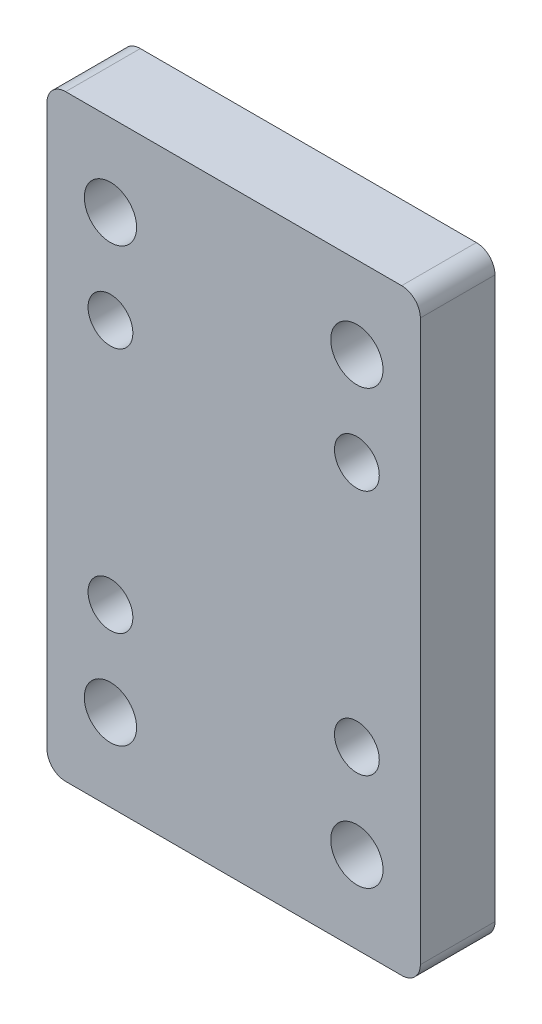
ISO-10303-21;
HEADER;
FILE_DESCRIPTION(('STEP AP214'),'2;1');
FILE_NAME('part.step','',(''),(''),'','','');
FILE_SCHEMA(('AUTOMOTIVE_DESIGN { 1 0 10303 214 1 1 1 1 }'));
ENDSEC;
DATA;
#1=APPLICATION_CONTEXT('core data for automotive mechanical design processes');
#2=APPLICATION_PROTOCOL_DEFINITION('international standard','automotive_design',2000,#1);
#3=PRODUCT_CONTEXT('',#1,'mechanical');
#4=PRODUCT('Part','Part','',(#3));
#5=PRODUCT_RELATED_PRODUCT_CATEGORY('part','',(#4));
#6=PRODUCT_DEFINITION_FORMATION('','',#4);
#7=PRODUCT_DEFINITION_CONTEXT('part definition',#1,'design');
#8=PRODUCT_DEFINITION('design','',#6,#7);
#9=PRODUCT_DEFINITION_SHAPE('','',#8);
#10=(LENGTH_UNIT() NAMED_UNIT(*) SI_UNIT(.MILLI.,.METRE.));
#11=(NAMED_UNIT(*) PLANE_ANGLE_UNIT() SI_UNIT($,.RADIAN.));
#12=(NAMED_UNIT(*) SI_UNIT($,.STERADIAN.) SOLID_ANGLE_UNIT());
#13=UNCERTAINTY_MEASURE_WITH_UNIT(LENGTH_MEASURE(1.E-05),#10,'distance_accuracy_value','');
#14=(GEOMETRIC_REPRESENTATION_CONTEXT(3) GLOBAL_UNCERTAINTY_ASSIGNED_CONTEXT((#13)) GLOBAL_UNIT_ASSIGNED_CONTEXT((#10,
#11,#12)) REPRESENTATION_CONTEXT('',''));
#15=CARTESIAN_POINT('',(0.,0.,0.));
#16=DIRECTION('',(0.,0.,1.));
#17=DIRECTION('',(1.,0.,0.));
#18=AXIS2_PLACEMENT_3D('',#15,#16,#17);
#19=CARTESIAN_POINT('',(-25.,40.,10.));
#20=DIRECTION('',(0.,0.,-1.));
#21=DIRECTION('',(-1.,0.,0.));
#22=AXIS2_PLACEMENT_3D('',#19,#20,#21);
#23=PLANE('',#22);
#24=CARTESIAN_POINT('',(-16.5,-29.,10.));
#25=DIRECTION('',(0.,0.,1.));
#26=DIRECTION('',(-1.,0.,0.));
#27=AXIS2_PLACEMENT_3D('',#24,#25,#26);
#28=CIRCLE('',#27,3.5);
#29=CARTESIAN_POINT('',(-20.,-29.,10.));
#30=VERTEX_POINT('',#29);
#31=EDGE_CURVE('E209',#30,#30,#28,.T.);
#32=ORIENTED_EDGE('',*,*,#31,.F.);
#33=EDGE_LOOP('',(#32));
#34=FACE_BOUND('',#33,.T.);
#35=CARTESIAN_POINT('',(16.5,-16.5,10.));
#36=DIRECTION('',(0.,0.,-1.));
#37=DIRECTION('',(1.,0.,0.));
#38=AXIS2_PLACEMENT_3D('',#35,#36,#37);
#39=CIRCLE('',#38,3.);
#40=CARTESIAN_POINT('',(19.5,-16.5,10.));
#41=VERTEX_POINT('',#40);
#42=EDGE_CURVE('E203',#41,#41,#39,.T.);
#43=ORIENTED_EDGE('',*,*,#42,.T.);
#44=EDGE_LOOP('',(#43));
#45=FACE_BOUND('',#44,.T.);
#46=CARTESIAN_POINT('',(16.5,-29.,10.));
#47=DIRECTION('',(0.,0.,-1.));
#48=DIRECTION('',(1.,0.,0.));
#49=AXIS2_PLACEMENT_3D('',#46,#47,#48);
#50=CIRCLE('',#49,3.5);
#51=CARTESIAN_POINT('',(20.,-29.,10.));
#52=VERTEX_POINT('',#51);
#53=EDGE_CURVE('E197',#52,#52,#50,.T.);
#54=ORIENTED_EDGE('',*,*,#53,.T.);
#55=EDGE_LOOP('',(#54));
#56=FACE_BOUND('',#55,.T.);
#57=CARTESIAN_POINT('',(16.5,29.,10.));
#58=DIRECTION('',(0.,0.,1.));
#59=DIRECTION('',(1.,0.,0.));
#60=AXIS2_PLACEMENT_3D('',#57,#58,#59);
#61=CIRCLE('',#60,3.5);
#62=CARTESIAN_POINT('',(20.,29.,10.));
#63=VERTEX_POINT('',#62);
#64=EDGE_CURVE('E185',#63,#63,#61,.T.);
#65=ORIENTED_EDGE('',*,*,#64,.F.);
#66=EDGE_LOOP('',(#65));
#67=FACE_BOUND('',#66,.T.);
#68=CARTESIAN_POINT('',(-16.5,16.5,10.));
#69=DIRECTION('',(0.,0.,-1.));
#70=DIRECTION('',(-1.,0.,0.));
#71=AXIS2_PLACEMENT_3D('',#68,#69,#70);
#72=CIRCLE('',#71,3.);
#73=CARTESIAN_POINT('',(-19.5,16.5,10.));
#74=VERTEX_POINT('',#73);
#75=EDGE_CURVE('E180',#74,#74,#72,.T.);
#76=ORIENTED_EDGE('',*,*,#75,.T.);
#77=EDGE_LOOP('',(#76));
#78=FACE_BOUND('',#77,.T.);
#79=CARTESIAN_POINT('',(-16.5,29.,10.));
#80=DIRECTION('',(0.,0.,-1.));
#81=DIRECTION('',(-1.,0.,0.));
#82=AXIS2_PLACEMENT_3D('',#79,#80,#81);
#83=CIRCLE('',#82,3.5);
#84=CARTESIAN_POINT('',(-20.,29.,10.));
#85=VERTEX_POINT('',#84);
#86=EDGE_CURVE('E175',#85,#85,#83,.T.);
#87=ORIENTED_EDGE('',*,*,#86,.T.);
#88=EDGE_LOOP('',(#87));
#89=FACE_BOUND('',#88,.T.);
#90=DIRECTION('',(1.,0.,0.));
#91=VECTOR('',#90,1.);
#92=CARTESIAN_POINT('',(-25.,-40.,10.));
#93=LINE('',#92,#91);
#94=CARTESIAN_POINT('',(-22.5,-40.,10.));
#95=VERTEX_POINT('',#94);
#96=CARTESIAN_POINT('',(22.5,-40.,10.));
#97=VERTEX_POINT('',#96);
#98=EDGE_CURVE('E166',#95,#97,#93,.T.);
#99=ORIENTED_EDGE('',*,*,#98,.T.);
#100=CARTESIAN_POINT('',(22.5,-37.5,10.));
#101=DIRECTION('',(0.,0.,-1.));
#102=DIRECTION('',(-1.,0.,0.));
#103=AXIS2_PLACEMENT_3D('',#100,#101,#102);
#104=CIRCLE('',#103,2.5);
#105=CARTESIAN_POINT('',(25.,-37.5,10.));
#106=VERTEX_POINT('',#105);
#107=EDGE_CURVE('E144',#97,#106,#104,.F.);
#108=ORIENTED_EDGE('',*,*,#107,.T.);
#109=DIRECTION('',(0.,1.,0.));
#110=VECTOR('',#109,1.);
#111=CARTESIAN_POINT('',(25.,-40.,10.));
#112=LINE('',#111,#110);
#113=CARTESIAN_POINT('',(25.,37.5,10.));
#114=VERTEX_POINT('',#113);
#115=EDGE_CURVE('E114',#106,#114,#112,.T.);
#116=ORIENTED_EDGE('',*,*,#115,.T.);
#117=CARTESIAN_POINT('',(22.5,37.5,10.));
#118=DIRECTION('',(0.,0.,-1.));
#119=DIRECTION('',(-1.,0.,0.));
#120=AXIS2_PLACEMENT_3D('',#117,#118,#119);
#121=CIRCLE('',#120,2.5);
#122=CARTESIAN_POINT('',(22.5,40.,10.));
#123=VERTEX_POINT('',#122);
#124=EDGE_CURVE('E50',#114,#123,#121,.F.);
#125=ORIENTED_EDGE('',*,*,#124,.T.);
#126=DIRECTION('',(-1.,0.,0.));
#127=VECTOR('',#126,1.);
#128=CARTESIAN_POINT('',(-25.,40.,10.));
#129=LINE('',#128,#127);
#130=CARTESIAN_POINT('',(-22.5,40.,10.));
#131=VERTEX_POINT('',#130);
#132=EDGE_CURVE('E130',#123,#131,#129,.T.);
#133=ORIENTED_EDGE('',*,*,#132,.T.);
#134=CARTESIAN_POINT('',(-22.5,37.5,10.));
#135=DIRECTION('',(0.,0.,-1.));
#136=DIRECTION('',(-1.,0.,0.));
#137=AXIS2_PLACEMENT_3D('',#134,#135,#136);
#138=CIRCLE('',#137,2.5);
#139=CARTESIAN_POINT('',(-25.,37.5,10.));
#140=VERTEX_POINT('',#139);
#141=EDGE_CURVE('E140',#131,#140,#138,.F.);
#142=ORIENTED_EDGE('',*,*,#141,.T.);
#143=DIRECTION('',(0.,-1.,0.));
#144=VECTOR('',#143,1.);
#145=CARTESIAN_POINT('',(-25.,-40.,10.));
#146=LINE('',#145,#144);
#147=CARTESIAN_POINT('',(-25.,-37.5,10.));
#148=VERTEX_POINT('',#147);
#149=EDGE_CURVE('E124',#140,#148,#146,.T.);
#150=ORIENTED_EDGE('',*,*,#149,.T.);
#151=CARTESIAN_POINT('',(-22.5,-37.5,10.));
#152=DIRECTION('',(0.,0.,-1.));
#153=DIRECTION('',(-1.,0.,0.));
#154=AXIS2_PLACEMENT_3D('',#151,#152,#153);
#155=CIRCLE('',#154,2.5);
#156=EDGE_CURVE('E142',#148,#95,#155,.F.);
#157=ORIENTED_EDGE('',*,*,#156,.T.);
#158=EDGE_LOOP('',(#99,#108,#116,#125,#133,#142,#150,#157));
#159=FACE_BOUND('',#158,.T.);
#160=CARTESIAN_POINT('',(16.5,16.5,10.));
#161=DIRECTION('',(0.,0.,1.));
#162=DIRECTION('',(1.,0.,0.));
#163=AXIS2_PLACEMENT_3D('',#160,#161,#162);
#164=CIRCLE('',#163,3.);
#165=CARTESIAN_POINT('',(19.5,16.5,10.));
#166=VERTEX_POINT('',#165);
#167=EDGE_CURVE('E191',#166,#166,#164,.T.);
#168=ORIENTED_EDGE('',*,*,#167,.F.);
#169=EDGE_LOOP('',(#168));
#170=FACE_BOUND('',#169,.T.);
#171=CARTESIAN_POINT('',(-16.5,-16.5,10.));
#172=DIRECTION('',(0.,0.,1.));
#173=DIRECTION('',(-1.,0.,0.));
#174=AXIS2_PLACEMENT_3D('',#171,#172,#173);
#175=CIRCLE('',#174,3.);
#176=CARTESIAN_POINT('',(-19.5,-16.5,10.));
#177=VERTEX_POINT('',#176);
#178=EDGE_CURVE('E215',#177,#177,#175,.T.);
#179=ORIENTED_EDGE('',*,*,#178,.F.);
#180=EDGE_LOOP('',(#179));
#181=FACE_BOUND('',#180,.T.);
#182=ADVANCED_FACE('F30',(#34,#45,#56,#67,#78,#89,#159,#170,#181),#23,.F.);
#183=CARTESIAN_POINT('',(-25.,40.,0.));
#184=DIRECTION('',(0.,0.,-1.));
#185=DIRECTION('',(-1.,0.,0.));
#186=AXIS2_PLACEMENT_3D('',#183,#184,#185);
#187=PLANE('',#186);
#188=CARTESIAN_POINT('',(-16.5,-29.,0.));
#189=DIRECTION('',(0.,0.,1.));
#190=DIRECTION('',(-1.,0.,0.));
#191=AXIS2_PLACEMENT_3D('',#188,#189,#190);
#192=CIRCLE('',#191,3.5);
#193=CARTESIAN_POINT('',(-20.,-29.,0.));
#194=VERTEX_POINT('',#193);
#195=EDGE_CURVE('E212',#194,#194,#192,.T.);
#196=ORIENTED_EDGE('',*,*,#195,.T.);
#197=EDGE_LOOP('',(#196));
#198=FACE_BOUND('',#197,.T.);
#199=CARTESIAN_POINT('',(16.5,-16.5,0.));
#200=DIRECTION('',(0.,0.,-1.));
#201=DIRECTION('',(1.,0.,0.));
#202=AXIS2_PLACEMENT_3D('',#199,#200,#201);
#203=CIRCLE('',#202,3.);
#204=CARTESIAN_POINT('',(19.5,-16.5,0.));
#205=VERTEX_POINT('',#204);
#206=EDGE_CURVE('E206',#205,#205,#203,.T.);
#207=ORIENTED_EDGE('',*,*,#206,.F.);
#208=EDGE_LOOP('',(#207));
#209=FACE_BOUND('',#208,.T.);
#210=CARTESIAN_POINT('',(16.5,-29.,0.));
#211=DIRECTION('',(0.,0.,-1.));
#212=DIRECTION('',(1.,0.,0.));
#213=AXIS2_PLACEMENT_3D('',#210,#211,#212);
#214=CIRCLE('',#213,3.5);
#215=CARTESIAN_POINT('',(20.,-29.,0.));
#216=VERTEX_POINT('',#215);
#217=EDGE_CURVE('E200',#216,#216,#214,.T.);
#218=ORIENTED_EDGE('',*,*,#217,.F.);
#219=EDGE_LOOP('',(#218));
#220=FACE_BOUND('',#219,.T.);
#221=CARTESIAN_POINT('',(16.5,29.,0.));
#222=DIRECTION('',(0.,0.,1.));
#223=DIRECTION('',(1.,0.,0.));
#224=AXIS2_PLACEMENT_3D('',#221,#222,#223);
#225=CIRCLE('',#224,3.5);
#226=CARTESIAN_POINT('',(20.,29.,0.));
#227=VERTEX_POINT('',#226);
#228=EDGE_CURVE('E188',#227,#227,#225,.T.);
#229=ORIENTED_EDGE('',*,*,#228,.T.);
#230=EDGE_LOOP('',(#229));
#231=FACE_BOUND('',#230,.T.);
#232=CARTESIAN_POINT('',(-16.5,16.5,0.));
#233=DIRECTION('',(0.,0.,-1.));
#234=DIRECTION('',(-1.,0.,0.));
#235=AXIS2_PLACEMENT_3D('',#232,#233,#234);
#236=CIRCLE('',#235,3.);
#237=CARTESIAN_POINT('',(-19.5,16.5,0.));
#238=VERTEX_POINT('',#237);
#239=EDGE_CURVE('E182',#238,#238,#236,.T.);
#240=ORIENTED_EDGE('',*,*,#239,.F.);
#241=EDGE_LOOP('',(#240));
#242=FACE_BOUND('',#241,.T.);
#243=CARTESIAN_POINT('',(-16.5,29.,0.));
#244=DIRECTION('',(0.,0.,-1.));
#245=DIRECTION('',(-1.,0.,0.));
#246=AXIS2_PLACEMENT_3D('',#243,#244,#245);
#247=CIRCLE('',#246,3.5);
#248=CARTESIAN_POINT('',(-20.,29.,0.));
#249=VERTEX_POINT('',#248);
#250=EDGE_CURVE('E171',#249,#249,#247,.T.);
#251=ORIENTED_EDGE('',*,*,#250,.F.);
#252=EDGE_LOOP('',(#251));
#253=FACE_BOUND('',#252,.T.);
#254=DIRECTION('',(0.,1.,0.));
#255=VECTOR('',#254,1.);
#256=CARTESIAN_POINT('',(25.,-40.,0.));
#257=LINE('',#256,#255);
#258=CARTESIAN_POINT('',(25.,-37.5,0.));
#259=VERTEX_POINT('',#258);
#260=CARTESIAN_POINT('',(25.,37.5,0.));
#261=VERTEX_POINT('',#260);
#262=EDGE_CURVE('E112',#259,#261,#257,.T.);
#263=ORIENTED_EDGE('',*,*,#262,.F.);
#264=CARTESIAN_POINT('',(22.5,-37.5,0.));
#265=DIRECTION('',(0.,0.,-1.));
#266=DIRECTION('',(-1.,0.,0.));
#267=AXIS2_PLACEMENT_3D('',#264,#265,#266);
#268=CIRCLE('',#267,2.5);
#269=CARTESIAN_POINT('',(22.5,-40.,0.));
#270=VERTEX_POINT('',#269);
#271=EDGE_CURVE('E95',#259,#270,#268,.T.);
#272=ORIENTED_EDGE('',*,*,#271,.T.);
#273=DIRECTION('',(1.,0.,0.));
#274=VECTOR('',#273,1.);
#275=CARTESIAN_POINT('',(-25.,-40.,0.));
#276=LINE('',#275,#274);
#277=CARTESIAN_POINT('',(-22.5,-40.,0.));
#278=VERTEX_POINT('',#277);
#279=EDGE_CURVE('E122',#278,#270,#276,.T.);
#280=ORIENTED_EDGE('',*,*,#279,.F.);
#281=CARTESIAN_POINT('',(-22.5,-37.5,0.));
#282=DIRECTION('',(0.,0.,-1.));
#283=DIRECTION('',(-1.,0.,0.));
#284=AXIS2_PLACEMENT_3D('',#281,#282,#283);
#285=CIRCLE('',#284,2.5);
#286=CARTESIAN_POINT('',(-25.,-37.5,0.));
#287=VERTEX_POINT('',#286);
#288=EDGE_CURVE('E106',#278,#287,#285,.T.);
#289=ORIENTED_EDGE('',*,*,#288,.T.);
#290=DIRECTION('',(0.,-1.,0.));
#291=VECTOR('',#290,1.);
#292=CARTESIAN_POINT('',(-25.,-40.,0.));
#293=LINE('',#292,#291);
#294=CARTESIAN_POINT('',(-25.,37.5,0.));
#295=VERTEX_POINT('',#294);
#296=EDGE_CURVE('E126',#295,#287,#293,.T.);
#297=ORIENTED_EDGE('',*,*,#296,.F.);
#298=CARTESIAN_POINT('',(-22.5,37.5,0.));
#299=DIRECTION('',(0.,0.,-1.));
#300=DIRECTION('',(-1.,0.,0.));
#301=AXIS2_PLACEMENT_3D('',#298,#299,#300);
#302=CIRCLE('',#301,2.5);
#303=CARTESIAN_POINT('',(-22.5,40.,0.));
#304=VERTEX_POINT('',#303);
#305=EDGE_CURVE('E133',#295,#304,#302,.T.);
#306=ORIENTED_EDGE('',*,*,#305,.T.);
#307=DIRECTION('',(-1.,0.,0.));
#308=VECTOR('',#307,1.);
#309=CARTESIAN_POINT('',(-25.,40.,0.));
#310=LINE('',#309,#308);
#311=CARTESIAN_POINT('',(22.5,40.,0.));
#312=VERTEX_POINT('',#311);
#313=EDGE_CURVE('E121',#312,#304,#310,.T.);
#314=ORIENTED_EDGE('',*,*,#313,.F.);
#315=CARTESIAN_POINT('',(22.5,37.5,0.));
#316=DIRECTION('',(0.,0.,-1.));
#317=DIRECTION('',(-1.,0.,0.));
#318=AXIS2_PLACEMENT_3D('',#315,#316,#317);
#319=CIRCLE('',#318,2.5);
#320=EDGE_CURVE('E115',#312,#261,#319,.T.);
#321=ORIENTED_EDGE('',*,*,#320,.T.);
#322=EDGE_LOOP('',(#263,#272,#280,#289,#297,#306,#314,#321));
#323=FACE_BOUND('',#322,.T.);
#324=CARTESIAN_POINT('',(16.5,16.5,0.));
#325=DIRECTION('',(0.,0.,1.));
#326=DIRECTION('',(1.,0.,0.));
#327=AXIS2_PLACEMENT_3D('',#324,#325,#326);
#328=CIRCLE('',#327,3.);
#329=CARTESIAN_POINT('',(19.5,16.5,0.));
#330=VERTEX_POINT('',#329);
#331=EDGE_CURVE('E194',#330,#330,#328,.T.);
#332=ORIENTED_EDGE('',*,*,#331,.T.);
#333=EDGE_LOOP('',(#332));
#334=FACE_BOUND('',#333,.T.);
#335=CARTESIAN_POINT('',(-16.5,-16.5,0.));
#336=DIRECTION('',(0.,0.,1.));
#337=DIRECTION('',(-1.,0.,0.));
#338=AXIS2_PLACEMENT_3D('',#335,#336,#337);
#339=CIRCLE('',#338,3.);
#340=CARTESIAN_POINT('',(-19.5,-16.5,0.));
#341=VERTEX_POINT('',#340);
#342=EDGE_CURVE('E218',#341,#341,#339,.T.);
#343=ORIENTED_EDGE('',*,*,#342,.T.);
#344=EDGE_LOOP('',(#343));
#345=FACE_BOUND('',#344,.T.);
#346=ADVANCED_FACE('F118',(#198,#209,#220,#231,#242,#253,#323,#334,#345),#187,.T.);
#347=CARTESIAN_POINT('',(-25.,-40.,10.));
#348=DIRECTION('',(1.,0.,0.));
#349=DIRECTION('',(0.,1.,0.));
#350=AXIS2_PLACEMENT_3D('',#347,#348,#349);
#351=PLANE('',#350);
#352=ORIENTED_EDGE('',*,*,#296,.T.);
#353=DIRECTION('',(0.,0.,-1.));
#354=VECTOR('',#353,1.);
#355=CARTESIAN_POINT('',(-25.,-37.5,10.));
#356=LINE('',#355,#354);
#357=EDGE_CURVE('E149',#287,#148,#356,.F.);
#358=ORIENTED_EDGE('',*,*,#357,.T.);
#359=ORIENTED_EDGE('',*,*,#149,.F.);
#360=DIRECTION('',(0.,0.,-1.));
#361=VECTOR('',#360,1.);
#362=CARTESIAN_POINT('',(-25.,37.5,10.));
#363=LINE('',#362,#361);
#364=EDGE_CURVE('E146',#140,#295,#363,.T.);
#365=ORIENTED_EDGE('',*,*,#364,.T.);
#366=EDGE_LOOP('',(#352,#358,#359,#365));
#367=FACE_BOUND('',#366,.T.);
#368=ADVANCED_FACE('F162',(#367),#351,.F.);
#369=CARTESIAN_POINT('',(-25.,-40.,10.));
#370=DIRECTION('',(0.,1.,0.));
#371=DIRECTION('',(-1.,0.,0.));
#372=AXIS2_PLACEMENT_3D('',#369,#370,#371);
#373=PLANE('',#372);
#374=ORIENTED_EDGE('',*,*,#279,.T.);
#375=DIRECTION('',(0.,0.,-1.));
#376=VECTOR('',#375,1.);
#377=CARTESIAN_POINT('',(22.5,-40.,10.));
#378=LINE('',#377,#376);
#379=EDGE_CURVE('E100',#270,#97,#378,.F.);
#380=ORIENTED_EDGE('',*,*,#379,.T.);
#381=ORIENTED_EDGE('',*,*,#98,.F.);
#382=DIRECTION('',(0.,0.,-1.));
#383=VECTOR('',#382,1.);
#384=CARTESIAN_POINT('',(-22.5,-40.,10.));
#385=LINE('',#384,#383);
#386=EDGE_CURVE('E105',#95,#278,#385,.T.);
#387=ORIENTED_EDGE('',*,*,#386,.T.);
#388=EDGE_LOOP('',(#374,#380,#381,#387));
#389=FACE_BOUND('',#388,.T.);
#390=ADVANCED_FACE('F245',(#389),#373,.F.);
#391=CARTESIAN_POINT('',(25.,-40.,10.));
#392=DIRECTION('',(-1.,0.,0.));
#393=DIRECTION('',(0.,-1.,0.));
#394=AXIS2_PLACEMENT_3D('',#391,#392,#393);
#395=PLANE('',#394);
#396=ORIENTED_EDGE('',*,*,#115,.F.);
#397=DIRECTION('',(0.,0.,-1.));
#398=VECTOR('',#397,1.);
#399=CARTESIAN_POINT('',(25.,-37.5,10.));
#400=LINE('',#399,#398);
#401=EDGE_CURVE('E99',#106,#259,#400,.T.);
#402=ORIENTED_EDGE('',*,*,#401,.T.);
#403=ORIENTED_EDGE('',*,*,#262,.T.);
#404=DIRECTION('',(0.,0.,-1.));
#405=VECTOR('',#404,1.);
#406=CARTESIAN_POINT('',(25.,37.5,10.));
#407=LINE('',#406,#405);
#408=EDGE_CURVE('E116',#261,#114,#407,.F.);
#409=ORIENTED_EDGE('',*,*,#408,.T.);
#410=EDGE_LOOP('',(#396,#402,#403,#409));
#411=FACE_BOUND('',#410,.T.);
#412=ADVANCED_FACE('F111',(#411),#395,.F.);
#413=CARTESIAN_POINT('',(-25.,40.,10.));
#414=DIRECTION('',(0.,-1.,0.));
#415=DIRECTION('',(1.,0.,0.));
#416=AXIS2_PLACEMENT_3D('',#413,#414,#415);
#417=PLANE('',#416);
#418=ORIENTED_EDGE('',*,*,#313,.T.);
#419=DIRECTION('',(0.,0.,-1.));
#420=VECTOR('',#419,1.);
#421=CARTESIAN_POINT('',(-22.5,40.,10.));
#422=LINE('',#421,#420);
#423=EDGE_CURVE('E11',#304,#131,#422,.F.);
#424=ORIENTED_EDGE('',*,*,#423,.T.);
#425=ORIENTED_EDGE('',*,*,#132,.F.);
#426=DIRECTION('',(0.,0.,-1.));
#427=VECTOR('',#426,1.);
#428=CARTESIAN_POINT('',(22.5,40.,10.));
#429=LINE('',#428,#427);
#430=EDGE_CURVE('E38',#123,#312,#429,.T.);
#431=ORIENTED_EDGE('',*,*,#430,.T.);
#432=EDGE_LOOP('',(#418,#424,#425,#431));
#433=FACE_BOUND('',#432,.T.);
#434=ADVANCED_FACE('F152',(#433),#417,.F.);
#435=CARTESIAN_POINT('',(-16.5,29.,10.));
#436=DIRECTION('',(0.,0.,-1.));
#437=DIRECTION('',(-1.,0.,0.));
#438=AXIS2_PLACEMENT_3D('',#435,#436,#437);
#439=CYLINDRICAL_SURFACE('',#438,3.5);
#440=ORIENTED_EDGE('',*,*,#86,.F.);
#441=EDGE_LOOP('',(#440));
#442=FACE_BOUND('',#441,.T.);
#443=ORIENTED_EDGE('',*,*,#250,.T.);
#444=EDGE_LOOP('',(#443));
#445=FACE_BOUND('',#444,.T.);
#446=ADVANCED_FACE('F238',(#442,#445),#439,.F.);
#447=CARTESIAN_POINT('',(-16.5,16.5,10.));
#448=DIRECTION('',(0.,0.,-1.));
#449=DIRECTION('',(-1.,0.,0.));
#450=AXIS2_PLACEMENT_3D('',#447,#448,#449);
#451=CYLINDRICAL_SURFACE('',#450,3.);
#452=ORIENTED_EDGE('',*,*,#75,.F.);
#453=EDGE_LOOP('',(#452));
#454=FACE_BOUND('',#453,.T.);
#455=ORIENTED_EDGE('',*,*,#239,.T.);
#456=EDGE_LOOP('',(#455));
#457=FACE_BOUND('',#456,.T.);
#458=ADVANCED_FACE('F293',(#454,#457),#451,.F.);
#459=CARTESIAN_POINT('',(16.5,29.,10.));
#460=DIRECTION('',(0.,0.,-1.));
#461=DIRECTION('',(-1.,0.,0.));
#462=AXIS2_PLACEMENT_3D('',#459,#460,#461);
#463=CYLINDRICAL_SURFACE('',#462,3.5);
#464=ORIENTED_EDGE('',*,*,#64,.T.);
#465=EDGE_LOOP('',(#464));
#466=FACE_BOUND('',#465,.T.);
#467=ORIENTED_EDGE('',*,*,#228,.F.);
#468=EDGE_LOOP('',(#467));
#469=FACE_BOUND('',#468,.T.);
#470=ADVANCED_FACE('F271',(#466,#469),#463,.F.);
#471=CARTESIAN_POINT('',(16.5,16.5,10.));
#472=DIRECTION('',(0.,0.,-1.));
#473=DIRECTION('',(-1.,0.,0.));
#474=AXIS2_PLACEMENT_3D('',#471,#472,#473);
#475=CYLINDRICAL_SURFACE('',#474,3.);
#476=ORIENTED_EDGE('',*,*,#167,.T.);
#477=EDGE_LOOP('',(#476));
#478=FACE_BOUND('',#477,.T.);
#479=ORIENTED_EDGE('',*,*,#331,.F.);
#480=EDGE_LOOP('',(#479));
#481=FACE_BOUND('',#480,.T.);
#482=ADVANCED_FACE('F267',(#478,#481),#475,.F.);
#483=CARTESIAN_POINT('',(16.5,-29.,10.));
#484=DIRECTION('',(0.,0.,-1.));
#485=DIRECTION('',(-1.,0.,0.));
#486=AXIS2_PLACEMENT_3D('',#483,#484,#485);
#487=CYLINDRICAL_SURFACE('',#486,3.5);
#488=ORIENTED_EDGE('',*,*,#53,.F.);
#489=EDGE_LOOP('',(#488));
#490=FACE_BOUND('',#489,.T.);
#491=ORIENTED_EDGE('',*,*,#217,.T.);
#492=EDGE_LOOP('',(#491));
#493=FACE_BOUND('',#492,.T.);
#494=ADVANCED_FACE('F270',(#490,#493),#487,.F.);
#495=CARTESIAN_POINT('',(16.5,-16.5,10.));
#496=DIRECTION('',(0.,0.,-1.));
#497=DIRECTION('',(-1.,0.,0.));
#498=AXIS2_PLACEMENT_3D('',#495,#496,#497);
#499=CYLINDRICAL_SURFACE('',#498,3.);
#500=ORIENTED_EDGE('',*,*,#42,.F.);
#501=EDGE_LOOP('',(#500));
#502=FACE_BOUND('',#501,.T.);
#503=ORIENTED_EDGE('',*,*,#206,.T.);
#504=EDGE_LOOP('',(#503));
#505=FACE_BOUND('',#504,.T.);
#506=ADVANCED_FACE('F282',(#502,#505),#499,.F.);
#507=CARTESIAN_POINT('',(-16.5,-29.,10.));
#508=DIRECTION('',(0.,0.,-1.));
#509=DIRECTION('',(-1.,0.,0.));
#510=AXIS2_PLACEMENT_3D('',#507,#508,#509);
#511=CYLINDRICAL_SURFACE('',#510,3.5);
#512=ORIENTED_EDGE('',*,*,#31,.T.);
#513=EDGE_LOOP('',(#512));
#514=FACE_BOUND('',#513,.T.);
#515=ORIENTED_EDGE('',*,*,#195,.F.);
#516=EDGE_LOOP('',(#515));
#517=FACE_BOUND('',#516,.T.);
#518=ADVANCED_FACE('F277',(#514,#517),#511,.F.);
#519=CARTESIAN_POINT('',(-16.5,-16.5,10.));
#520=DIRECTION('',(0.,0.,-1.));
#521=DIRECTION('',(-1.,0.,0.));
#522=AXIS2_PLACEMENT_3D('',#519,#520,#521);
#523=CYLINDRICAL_SURFACE('',#522,3.);
#524=ORIENTED_EDGE('',*,*,#178,.T.);
#525=EDGE_LOOP('',(#524));
#526=FACE_BOUND('',#525,.T.);
#527=ORIENTED_EDGE('',*,*,#342,.F.);
#528=EDGE_LOOP('',(#527));
#529=FACE_BOUND('',#528,.T.);
#530=ADVANCED_FACE('F224',(#526,#529),#523,.F.);
#531=CARTESIAN_POINT('',(22.5,-37.5,10.));
#532=DIRECTION('',(0.,0.,-1.));
#533=DIRECTION('',(-1.,0.,0.));
#534=AXIS2_PLACEMENT_3D('',#531,#532,#533);
#535=CYLINDRICAL_SURFACE('',#534,2.5);
#536=ORIENTED_EDGE('',*,*,#107,.F.);
#537=ORIENTED_EDGE('',*,*,#379,.F.);
#538=ORIENTED_EDGE('',*,*,#271,.F.);
#539=ORIENTED_EDGE('',*,*,#401,.F.);
#540=EDGE_LOOP('',(#536,#537,#538,#539));
#541=FACE_BOUND('',#540,.T.);
#542=ADVANCED_FACE('F98',(#541),#535,.T.);
#543=CARTESIAN_POINT('',(-22.5,-37.5,10.));
#544=DIRECTION('',(0.,0.,-1.));
#545=DIRECTION('',(-1.,0.,0.));
#546=AXIS2_PLACEMENT_3D('',#543,#544,#545);
#547=CYLINDRICAL_SURFACE('',#546,2.5);
#548=ORIENTED_EDGE('',*,*,#156,.F.);
#549=ORIENTED_EDGE('',*,*,#357,.F.);
#550=ORIENTED_EDGE('',*,*,#288,.F.);
#551=ORIENTED_EDGE('',*,*,#386,.F.);
#552=EDGE_LOOP('',(#548,#549,#550,#551));
#553=FACE_BOUND('',#552,.T.);
#554=ADVANCED_FACE('F253',(#553),#547,.T.);
#555=CARTESIAN_POINT('',(-22.5,37.5,10.));
#556=DIRECTION('',(0.,0.,-1.));
#557=DIRECTION('',(-1.,0.,0.));
#558=AXIS2_PLACEMENT_3D('',#555,#556,#557);
#559=CYLINDRICAL_SURFACE('',#558,2.5);
#560=ORIENTED_EDGE('',*,*,#141,.F.);
#561=ORIENTED_EDGE('',*,*,#423,.F.);
#562=ORIENTED_EDGE('',*,*,#305,.F.);
#563=ORIENTED_EDGE('',*,*,#364,.F.);
#564=EDGE_LOOP('',(#560,#561,#562,#563));
#565=FACE_BOUND('',#564,.T.);
#566=ADVANCED_FACE('F159',(#565),#559,.T.);
#567=CARTESIAN_POINT('',(22.5,37.5,10.));
#568=DIRECTION('',(0.,0.,-1.));
#569=DIRECTION('',(-1.,0.,0.));
#570=AXIS2_PLACEMENT_3D('',#567,#568,#569);
#571=CYLINDRICAL_SURFACE('',#570,2.5);
#572=ORIENTED_EDGE('',*,*,#124,.F.);
#573=ORIENTED_EDGE('',*,*,#408,.F.);
#574=ORIENTED_EDGE('',*,*,#320,.F.);
#575=ORIENTED_EDGE('',*,*,#430,.F.);
#576=EDGE_LOOP('',(#572,#573,#574,#575));
#577=FACE_BOUND('',#576,.T.);
#578=ADVANCED_FACE('F32',(#577),#571,.T.);
#579=CLOSED_SHELL('',(#182,#346,#368,#390,#412,#434,#446,#458,#470,#482,#494,#506,#518,#530,
#542,#554,#566,#578));
#580=MANIFOLD_SOLID_BREP('B2',#579);
#581=ADVANCED_BREP_SHAPE_REPRESENTATION('',(#18,#580),#14);
#582=SHAPE_DEFINITION_REPRESENTATION(#9,#581);
ENDSEC;
END-ISO-10303-21;
